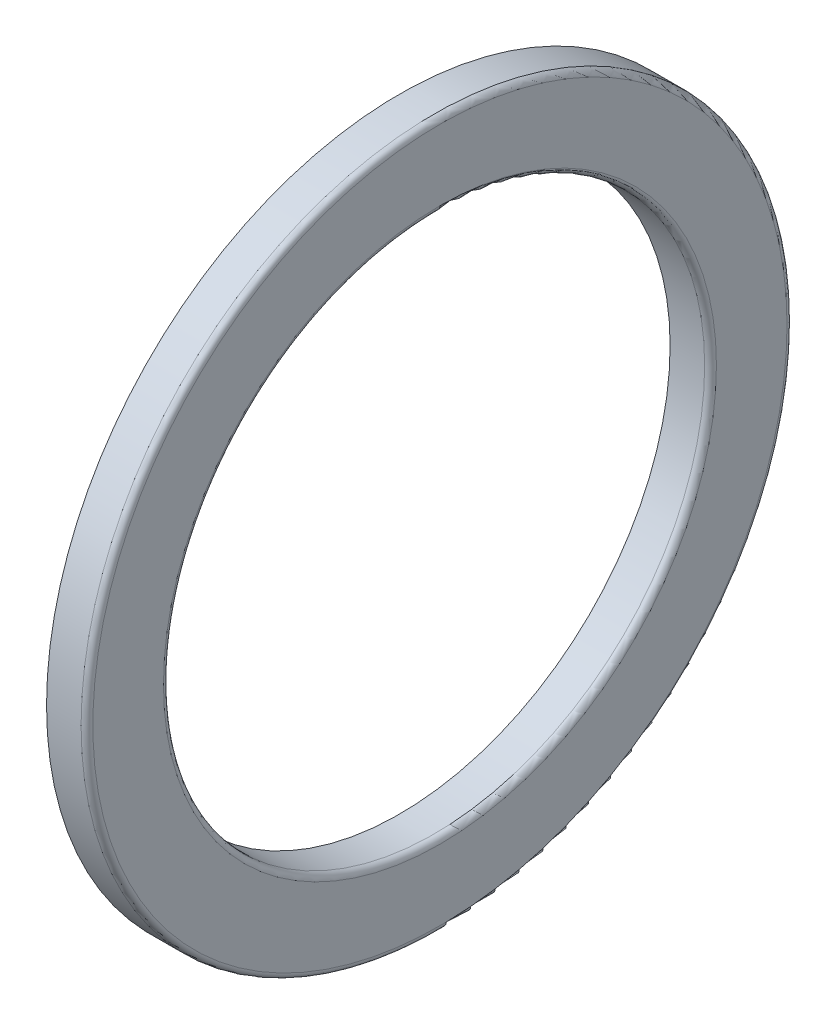
ISO-10303-21;
HEADER;
FILE_DESCRIPTION(('STEP AP214'),'2;1');
FILE_NAME('part.step','',(''),(''),'','','');
FILE_SCHEMA(('AUTOMOTIVE_DESIGN { 1 0 10303 214 1 1 1 1 }'));
ENDSEC;
DATA;
#1=APPLICATION_CONTEXT('core data for automotive mechanical design processes');
#2=APPLICATION_PROTOCOL_DEFINITION('international standard','automotive_design',2000,#1);
#3=PRODUCT_CONTEXT('',#1,'mechanical');
#4=PRODUCT('Part','Part','',(#3));
#5=PRODUCT_RELATED_PRODUCT_CATEGORY('part','',(#4));
#6=PRODUCT_DEFINITION_FORMATION('','',#4);
#7=PRODUCT_DEFINITION_CONTEXT('part definition',#1,'design');
#8=PRODUCT_DEFINITION('design','',#6,#7);
#9=PRODUCT_DEFINITION_SHAPE('','',#8);
#10=(LENGTH_UNIT() NAMED_UNIT(*) SI_UNIT(.MILLI.,.METRE.));
#11=(NAMED_UNIT(*) PLANE_ANGLE_UNIT() SI_UNIT($,.RADIAN.));
#12=(NAMED_UNIT(*) SI_UNIT($,.STERADIAN.) SOLID_ANGLE_UNIT());
#13=UNCERTAINTY_MEASURE_WITH_UNIT(LENGTH_MEASURE(1.E-05),#10,'distance_accuracy_value','');
#14=(GEOMETRIC_REPRESENTATION_CONTEXT(3) GLOBAL_UNCERTAINTY_ASSIGNED_CONTEXT((#13)) GLOBAL_UNIT_ASSIGNED_CONTEXT((#10,
#11,#12)) REPRESENTATION_CONTEXT('',''));
#15=CARTESIAN_POINT('',(0.,0.,0.));
#16=DIRECTION('',(0.,0.,1.));
#17=DIRECTION('',(1.,0.,0.));
#18=AXIS2_PLACEMENT_3D('',#15,#16,#17);
#19=CARTESIAN_POINT('',(15.1276,0.,0.));
#20=DIRECTION('',(1.,0.,0.));
#21=DIRECTION('',(0.,0.,-1.));
#22=AXIS2_PLACEMENT_3D('',#19,#20,#21);
#23=CYLINDRICAL_SURFACE('',#22,60.0000000000333);
#24=CARTESIAN_POINT('',(15.1276,0.,0.));
#25=DIRECTION('',(1.,0.,0.));
#26=DIRECTION('',(0.,0.,-1.));
#27=AXIS2_PLACEMENT_3D('',#24,#25,#26);
#28=CIRCLE('',#27,60.0000000000333);
#29=CARTESIAN_POINT('',(15.1276,0.,-60.0000000000333));
#30=VERTEX_POINT('',#29);
#31=EDGE_CURVE('E63',#30,#30,#28,.T.);
#32=ORIENTED_EDGE('',*,*,#31,.T.);
#33=EDGE_LOOP('',(#32));
#34=FACE_BOUND('',#33,.T.);
#35=CARTESIAN_POINT('',(21.0000000000349,0.,0.));
#36=DIRECTION('',(1.,0.,0.));
#37=DIRECTION('',(0.,0.,-1.));
#38=AXIS2_PLACEMENT_3D('',#35,#36,#37);
#39=CIRCLE('',#38,60.0000000000333);
#40=CARTESIAN_POINT('',(21.0000000000349,0.,-60.0000000000333));
#41=VERTEX_POINT('',#40);
#42=EDGE_CURVE('E10',#41,#41,#39,.T.);
#43=ORIENTED_EDGE('',*,*,#42,.F.);
#44=EDGE_LOOP('',(#43));
#45=FACE_BOUND('',#44,.T.);
#46=ADVANCED_FACE('F35',(#34,#45),#23,.T.);
#47=CARTESIAN_POINT('',(21.0000000000349,0.,0.));
#48=DIRECTION('',(1.,0.,0.));
#49=DIRECTION('',(0.,0.,-1.));
#50=AXIS2_PLACEMENT_3D('',#47,#48,#49);
#51=TOROIDAL_SURFACE('',#50,59.0000000000016,1.0000000000317);
#52=ORIENTED_EDGE('',*,*,#42,.T.);
#53=EDGE_LOOP('',(#52));
#54=FACE_BOUND('',#53,.T.);
#55=CARTESIAN_POINT('',(22.,0.,0.));
#56=DIRECTION('',(1.,0.,0.));
#57=DIRECTION('',(0.,0.,-1.));
#58=AXIS2_PLACEMENT_3D('',#55,#56,#57);
#59=CIRCLE('',#58,58.9999884600984);
#60=CARTESIAN_POINT('',(22.,0.,-58.9999884600984));
#61=VERTEX_POINT('',#60);
#62=EDGE_CURVE('E41',#61,#61,#59,.T.);
#63=ORIENTED_EDGE('',*,*,#62,.F.);
#64=EDGE_LOOP('',(#63));
#65=FACE_BOUND('',#64,.T.);
#66=ADVANCED_FACE('F81',(#54,#65),#51,.T.);
#67=CARTESIAN_POINT('',(22.,46.9999999999985,0.));
#68=DIRECTION('',(1.,0.,0.));
#69=DIRECTION('',(0.,0.,-1.));
#70=AXIS2_PLACEMENT_3D('',#67,#68,#69);
#71=PLANE('',#70);
#72=ORIENTED_EDGE('',*,*,#62,.T.);
#73=EDGE_LOOP('',(#72));
#74=FACE_BOUND('',#73,.T.);
#75=CARTESIAN_POINT('',(22.,0.,0.));
#76=DIRECTION('',(1.,0.,0.));
#77=DIRECTION('',(0.,0.,-1.));
#78=AXIS2_PLACEMENT_3D('',#75,#76,#77);
#79=CIRCLE('',#78,46.9999999999985);
#80=CARTESIAN_POINT('',(22.,0.,-46.9999999999985));
#81=VERTEX_POINT('',#80);
#82=EDGE_CURVE('E45',#81,#81,#79,.T.);
#83=ORIENTED_EDGE('',*,*,#82,.F.);
#84=EDGE_LOOP('',(#83));
#85=FACE_BOUND('',#84,.T.);
#86=ADVANCED_FACE('F85',(#74,#85),#71,.T.);
#87=CARTESIAN_POINT('',(21.0000000000015,0.,0.));
#88=DIRECTION('',(1.,0.,0.));
#89=DIRECTION('',(0.,0.,-1.));
#90=AXIS2_PLACEMENT_3D('',#87,#88,#89);
#91=TOROIDAL_SURFACE('',#90,46.9999999999985,0.999999999998474);
#92=ORIENTED_EDGE('',*,*,#82,.T.);
#93=EDGE_LOOP('',(#92));
#94=FACE_BOUND('',#93,.T.);
#95=CARTESIAN_POINT('',(21.0000000000015,0.,0.));
#96=DIRECTION('',(1.,0.,0.));
#97=DIRECTION('',(0.,0.,-1.));
#98=AXIS2_PLACEMENT_3D('',#95,#96,#97);
#99=CIRCLE('',#98,46.);
#100=CARTESIAN_POINT('',(21.0000000000015,0.,-46.));
#101=VERTEX_POINT('',#100);
#102=EDGE_CURVE('E49',#101,#101,#99,.T.);
#103=ORIENTED_EDGE('',*,*,#102,.F.);
#104=EDGE_LOOP('',(#103));
#105=FACE_BOUND('',#104,.T.);
#106=ADVANCED_FACE('F89',(#94,#105),#91,.T.);
#107=CARTESIAN_POINT('',(15.1276,0.,0.));
#108=DIRECTION('',(1.,0.,0.));
#109=DIRECTION('',(0.,0.,-1.));
#110=AXIS2_PLACEMENT_3D('',#107,#108,#109);
#111=CYLINDRICAL_SURFACE('',#110,46.);
#112=ORIENTED_EDGE('',*,*,#102,.T.);
#113=EDGE_LOOP('',(#112));
#114=FACE_BOUND('',#113,.T.);
#115=CARTESIAN_POINT('',(15.1276,0.,0.));
#116=DIRECTION('',(1.,0.,0.));
#117=DIRECTION('',(0.,0.,-1.));
#118=AXIS2_PLACEMENT_3D('',#115,#116,#117);
#119=CIRCLE('',#118,46.);
#120=CARTESIAN_POINT('',(15.1276,0.,-46.));
#121=VERTEX_POINT('',#120);
#122=EDGE_CURVE('E54',#121,#121,#119,.T.);
#123=ORIENTED_EDGE('',*,*,#122,.F.);
#124=EDGE_LOOP('',(#123));
#125=FACE_BOUND('',#124,.T.);
#126=ADVANCED_FACE('F95',(#114,#125),#111,.F.);
#127=CARTESIAN_POINT('',(15.1276,49.4043,0.));
#128=DIRECTION('',(-1.,0.,0.));
#129=DIRECTION('',(0.,0.,1.));
#130=AXIS2_PLACEMENT_3D('',#127,#128,#129);
#131=PLANE('',#130);
#132=ORIENTED_EDGE('',*,*,#122,.T.);
#133=EDGE_LOOP('',(#132));
#134=FACE_BOUND('',#133,.T.);
#135=CARTESIAN_POINT('',(15.1276,0.,0.));
#136=DIRECTION('',(1.,0.,0.));
#137=DIRECTION('',(0.,0.,-1.));
#138=AXIS2_PLACEMENT_3D('',#135,#136,#137);
#139=CIRCLE('',#138,49.4043);
#140=CARTESIAN_POINT('',(15.1276,0.,-49.4043));
#141=VERTEX_POINT('',#140);
#142=EDGE_CURVE('E57',#141,#141,#139,.T.);
#143=ORIENTED_EDGE('',*,*,#142,.F.);
#144=EDGE_LOOP('',(#143));
#145=FACE_BOUND('',#144,.T.);
#146=ADVANCED_FACE('F77',(#134,#145),#131,.T.);
#147=CARTESIAN_POINT('',(11.,0.,0.));
#148=DIRECTION('',(1.,0.,0.));
#149=DIRECTION('',(0.,0.,-1.));
#150=AXIS2_PLACEMENT_3D('',#147,#148,#149);
#151=TOROIDAL_SURFACE('',#150,52.5,5.1595);
#152=ORIENTED_EDGE('',*,*,#142,.T.);
#153=EDGE_LOOP('',(#152));
#154=FACE_BOUND('',#153,.T.);
#155=CARTESIAN_POINT('',(15.1276,0.,0.));
#156=DIRECTION('',(1.,0.,0.));
#157=DIRECTION('',(0.,0.,-1.));
#158=AXIS2_PLACEMENT_3D('',#155,#156,#157);
#159=CIRCLE('',#158,55.5957);
#160=CARTESIAN_POINT('',(15.1276,0.,-55.5957));
#161=VERTEX_POINT('',#160);
#162=EDGE_CURVE('E60',#161,#161,#159,.T.);
#163=ORIENTED_EDGE('',*,*,#162,.F.);
#164=EDGE_LOOP('',(#163));
#165=FACE_BOUND('',#164,.T.);
#166=ADVANCED_FACE('F71',(#154,#165),#151,.F.);
#167=CARTESIAN_POINT('',(15.1276,60.0000000000333,0.));
#168=DIRECTION('',(-1.,0.,0.));
#169=DIRECTION('',(0.,0.,1.));
#170=AXIS2_PLACEMENT_3D('',#167,#168,#169);
#171=PLANE('',#170);
#172=ORIENTED_EDGE('',*,*,#162,.T.);
#173=EDGE_LOOP('',(#172));
#174=FACE_BOUND('',#173,.T.);
#175=ORIENTED_EDGE('',*,*,#31,.F.);
#176=EDGE_LOOP('',(#175));
#177=FACE_BOUND('',#176,.T.);
#178=ADVANCED_FACE('F69',(#174,#177),#171,.T.);
#179=CLOSED_SHELL('',(#46,#66,#86,#106,#126,#146,#166,#178));
#180=MANIFOLD_SOLID_BREP('B2',#179);
#181=ADVANCED_BREP_SHAPE_REPRESENTATION('',(#18,#180),#14);
#182=SHAPE_DEFINITION_REPRESENTATION(#9,#181);
ENDSEC;
END-ISO-10303-21;
